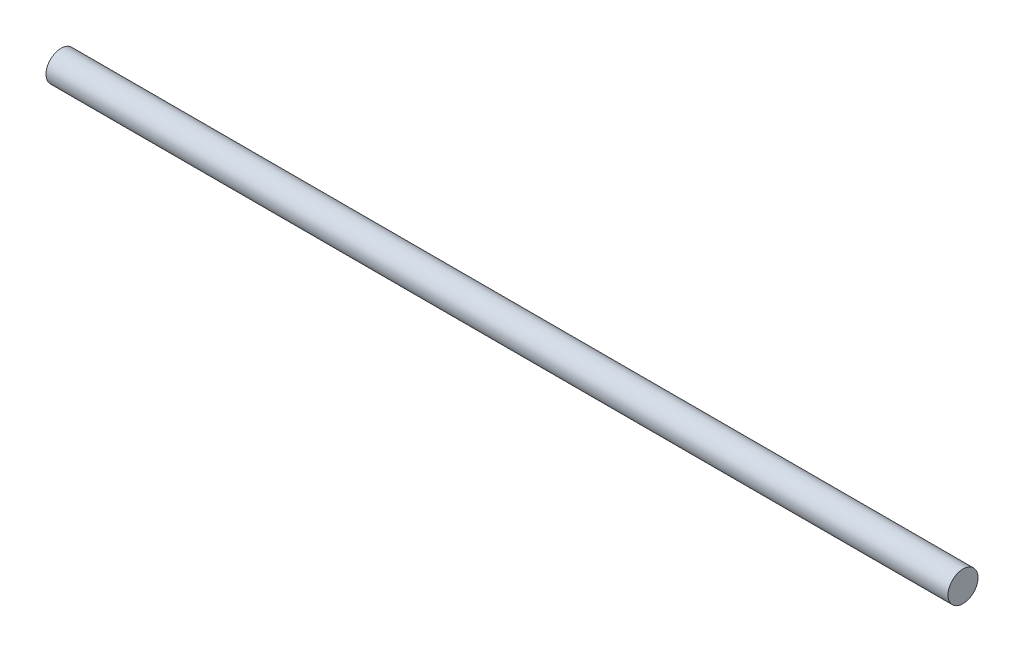
ISO-10303-21;
HEADER;
FILE_DESCRIPTION(('STEP AP214'),'2;1');
FILE_NAME('part.step','',(''),(''),'','','');
FILE_SCHEMA(('AUTOMOTIVE_DESIGN { 1 0 10303 214 1 1 1 1 }'));
ENDSEC;
DATA;
#1=APPLICATION_CONTEXT('core data for automotive mechanical design processes');
#2=APPLICATION_PROTOCOL_DEFINITION('international standard','automotive_design',2000,#1);
#3=PRODUCT_CONTEXT('',#1,'mechanical');
#4=PRODUCT('Part','Part','',(#3));
#5=PRODUCT_RELATED_PRODUCT_CATEGORY('part','',(#4));
#6=PRODUCT_DEFINITION_FORMATION('','',#4);
#7=PRODUCT_DEFINITION_CONTEXT('part definition',#1,'design');
#8=PRODUCT_DEFINITION('design','',#6,#7);
#9=PRODUCT_DEFINITION_SHAPE('','',#8);
#10=(LENGTH_UNIT() NAMED_UNIT(*) SI_UNIT(.MILLI.,.METRE.));
#11=(NAMED_UNIT(*) PLANE_ANGLE_UNIT() SI_UNIT($,.RADIAN.));
#12=(NAMED_UNIT(*) SI_UNIT($,.STERADIAN.) SOLID_ANGLE_UNIT());
#13=UNCERTAINTY_MEASURE_WITH_UNIT(LENGTH_MEASURE(1.E-05),#10,'distance_accuracy_value','');
#14=(GEOMETRIC_REPRESENTATION_CONTEXT(3) GLOBAL_UNCERTAINTY_ASSIGNED_CONTEXT((#13)) GLOBAL_UNIT_ASSIGNED_CONTEXT((#10,
#11,#12)) REPRESENTATION_CONTEXT('',''));
#15=CARTESIAN_POINT('',(0.,0.,0.));
#16=DIRECTION('',(0.,0.,1.));
#17=DIRECTION('',(1.,0.,0.));
#18=AXIS2_PLACEMENT_3D('',#15,#16,#17);
#19=CARTESIAN_POINT('',(90.,0.,0.));
#20=DIRECTION('',(-1.,0.,0.));
#21=DIRECTION('',(0.,0.,1.));
#22=AXIS2_PLACEMENT_3D('',#19,#20,#21);
#23=CYLINDRICAL_SURFACE('',#22,1.5);
#24=CARTESIAN_POINT('',(90.,0.,0.));
#25=DIRECTION('',(1.,0.,0.));
#26=DIRECTION('',(0.,0.,-1.));
#27=AXIS2_PLACEMENT_3D('',#24,#25,#26);
#28=CIRCLE('',#27,1.5);
#29=CARTESIAN_POINT('',(90.,0.,1.5));
#30=VERTEX_POINT('',#29);
#31=EDGE_CURVE('E10',#30,#30,#28,.T.);
#32=CARTESIAN_POINT('',(0.,0.,0.));
#33=DIRECTION('',(1.,0.,0.));
#34=DIRECTION('',(0.,0.,-1.));
#35=AXIS2_PLACEMENT_3D('',#32,#33,#34);
#36=CIRCLE('',#35,1.5);
#37=CARTESIAN_POINT('',(0.,0.,1.5));
#38=VERTEX_POINT('',#37);
#39=EDGE_CURVE('E44',#38,#38,#36,.T.);
#40=CARTESIAN_POINT('',(90.,0.,1.5));
#41=CARTESIAN_POINT('',(89.0625,0.,1.5));
#42=CARTESIAN_POINT('',(88.125,0.,1.5));
#43=CARTESIAN_POINT('',(86.25,0.,1.5));
#44=CARTESIAN_POINT('',(85.3125,0.,1.5));
#45=CARTESIAN_POINT('',(83.4375,0.,1.5));
#46=CARTESIAN_POINT('',(82.5,0.,1.5));
#47=CARTESIAN_POINT('',(80.625,0.,1.5));
#48=CARTESIAN_POINT('',(79.6875,0.,1.5));
#49=CARTESIAN_POINT('',(77.8125,0.,1.5));
#50=CARTESIAN_POINT('',(76.875,0.,1.5));
#51=CARTESIAN_POINT('',(75.,0.,1.5));
#52=CARTESIAN_POINT('',(74.0625,0.,1.5));
#53=CARTESIAN_POINT('',(72.1875,0.,1.5));
#54=CARTESIAN_POINT('',(71.25,0.,1.5));
#55=CARTESIAN_POINT('',(69.375,0.,1.5));
#56=CARTESIAN_POINT('',(68.4375,0.,1.5));
#57=CARTESIAN_POINT('',(66.5625,0.,1.5));
#58=CARTESIAN_POINT('',(65.625,0.,1.5));
#59=CARTESIAN_POINT('',(63.75,0.,1.5));
#60=CARTESIAN_POINT('',(62.8125,0.,1.5));
#61=CARTESIAN_POINT('',(60.9375,0.,1.5));
#62=CARTESIAN_POINT('',(60.,0.,1.5));
#63=CARTESIAN_POINT('',(58.125,0.,1.5));
#64=CARTESIAN_POINT('',(57.1875,0.,1.5));
#65=CARTESIAN_POINT('',(55.3125,0.,1.5));
#66=CARTESIAN_POINT('',(54.375,0.,1.5));
#67=CARTESIAN_POINT('',(52.5,0.,1.5));
#68=CARTESIAN_POINT('',(51.5625,0.,1.5));
#69=CARTESIAN_POINT('',(49.6875,0.,1.5));
#70=CARTESIAN_POINT('',(48.75,0.,1.5));
#71=CARTESIAN_POINT('',(46.875,0.,1.5));
#72=CARTESIAN_POINT('',(45.9375,0.,1.5));
#73=CARTESIAN_POINT('',(44.0625,0.,1.5));
#74=CARTESIAN_POINT('',(43.125,0.,1.5));
#75=CARTESIAN_POINT('',(41.25,0.,1.5));
#76=CARTESIAN_POINT('',(40.3125,0.,1.5));
#77=CARTESIAN_POINT('',(38.4375,0.,1.5));
#78=CARTESIAN_POINT('',(37.5,0.,1.5));
#79=CARTESIAN_POINT('',(35.625,0.,1.5));
#80=CARTESIAN_POINT('',(34.6875,0.,1.5));
#81=CARTESIAN_POINT('',(32.8125,0.,1.5));
#82=CARTESIAN_POINT('',(31.875,0.,1.5));
#83=CARTESIAN_POINT('',(30.,0.,1.5));
#84=CARTESIAN_POINT('',(29.0625,0.,1.5));
#85=CARTESIAN_POINT('',(27.1875,0.,1.5));
#86=CARTESIAN_POINT('',(26.25,0.,1.5));
#87=CARTESIAN_POINT('',(24.375,0.,1.5));
#88=CARTESIAN_POINT('',(23.4375,0.,1.5));
#89=CARTESIAN_POINT('',(21.5625,0.,1.5));
#90=CARTESIAN_POINT('',(20.625,0.,1.5));
#91=CARTESIAN_POINT('',(18.75,0.,1.5));
#92=CARTESIAN_POINT('',(17.8125,0.,1.5));
#93=CARTESIAN_POINT('',(15.9375,0.,1.5));
#94=CARTESIAN_POINT('',(15.,0.,1.5));
#95=CARTESIAN_POINT('',(13.125,0.,1.5));
#96=CARTESIAN_POINT('',(12.1875,0.,1.5));
#97=CARTESIAN_POINT('',(10.3125,0.,1.5));
#98=CARTESIAN_POINT('',(9.37499999999999,0.,1.5));
#99=CARTESIAN_POINT('',(7.49999999999999,0.,1.5));
#100=CARTESIAN_POINT('',(6.56249999999999,0.,1.5));
#101=CARTESIAN_POINT('',(4.68749999999999,0.,1.5));
#102=CARTESIAN_POINT('',(3.74999999999998,0.,1.5));
#103=CARTESIAN_POINT('',(1.87499999999998,0.,1.5));
#104=CARTESIAN_POINT('',(0.937499999999986,0.,1.5));
#105=CARTESIAN_POINT('',(0.,0.,1.5));
#106=B_SPLINE_CURVE_WITH_KNOTS('',3,(#40,#41,#42,#43,#44,#45,#46,#47,#48,#49,#50,#51,#52,#53,
#54,#55,#56,#57,#58,#59,#60,#61,#62,#63,#64,#65,#66,#67,#68,#69,#70,#71,#72,#73,#74,#75,#76,#77,
#78,#79,#80,#81,#82,#83,#84,#85,#86,#87,#88,#89,#90,#91,#92,#93,#94,#95,#96,#97,#98,#99,#100,
#101,#102,#103,#104,#105),.UNSPECIFIED.,.F.,.F.,(4,2,2,2,2,2,2,2,2,2,2,2,2,2,2,2,2,2,2,2,2,2,2,
2,2,2,2,2,2,2,2,2,4),(0.,2.81250000000001,5.62500000000001,8.43750000000001,11.25,14.0625,
16.875,19.6875,22.5,25.3125,28.125,30.9375,33.75,36.5625,39.375,42.1875,45.,47.8125,50.625,
53.4375,56.25,59.0625,61.875,64.6875,67.5,70.3125,73.125,75.9375,78.75,81.5625,84.375,87.1875,
90.),.UNSPECIFIED.);
#107=EDGE_CURVE('BSEAM41',#30,#38,#106,.T.);
#108=ORIENTED_EDGE('',*,*,#31,.F.);
#109=ORIENTED_EDGE('',*,*,#39,.T.);
#110=ORIENTED_EDGE('',*,*,#107,.T.);
#111=ORIENTED_EDGE('',*,*,#107,.F.);
#112=EDGE_LOOP('',(#108,#110,#109,#111));
#113=FACE_BOUND('',#112,.T.);
#114=ADVANCED_FACE('F41',(#113),#23,.T.);
#115=CARTESIAN_POINT('',(90.,0.,0.));
#116=DIRECTION('',(1.,0.,0.));
#117=DIRECTION('',(0.,0.,-1.));
#118=AXIS2_PLACEMENT_3D('',#115,#116,#117);
#119=PLANE('',#118);
#120=ORIENTED_EDGE('',*,*,#31,.T.);
#121=EDGE_LOOP('',(#120));
#122=FACE_BOUND('',#121,.T.);
#123=ADVANCED_FACE('F58',(#122),#119,.T.);
#124=CARTESIAN_POINT('',(0.,0.,0.));
#125=DIRECTION('',(1.,0.,0.));
#126=DIRECTION('',(0.,0.,-1.));
#127=AXIS2_PLACEMENT_3D('',#124,#125,#126);
#128=PLANE('',#127);
#129=ORIENTED_EDGE('',*,*,#39,.F.);
#130=EDGE_LOOP('',(#129));
#131=FACE_BOUND('',#130,.T.);
#132=ADVANCED_FACE('F56',(#131),#128,.F.);
#133=CLOSED_SHELL('',(#114,#123,#132));
#134=MANIFOLD_SOLID_BREP('B2',#133);
#135=ADVANCED_BREP_SHAPE_REPRESENTATION('',(#18,#134),#14);
#136=SHAPE_DEFINITION_REPRESENTATION(#9,#135);
ENDSEC;
END-ISO-10303-21;
